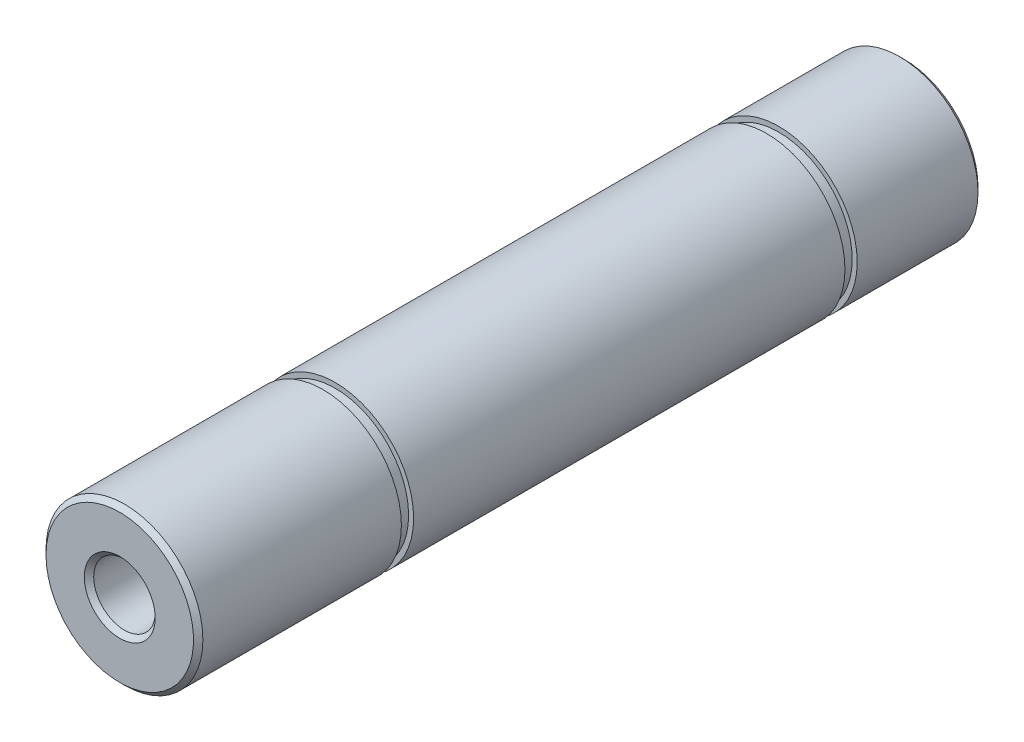
ISO-10303-21;
HEADER;
FILE_DESCRIPTION(('STEP AP214'),'2;1');
FILE_NAME('part.step','',(''),(''),'','','');
FILE_SCHEMA(('AUTOMOTIVE_DESIGN { 1 0 10303 214 1 1 1 1 }'));
ENDSEC;
DATA;
#1=APPLICATION_CONTEXT('core data for automotive mechanical design processes');
#2=APPLICATION_PROTOCOL_DEFINITION('international standard','automotive_design',2000,#1);
#3=PRODUCT_CONTEXT('',#1,'mechanical');
#4=PRODUCT('Part','Part','',(#3));
#5=PRODUCT_RELATED_PRODUCT_CATEGORY('part','',(#4));
#6=PRODUCT_DEFINITION_FORMATION('','',#4);
#7=PRODUCT_DEFINITION_CONTEXT('part definition',#1,'design');
#8=PRODUCT_DEFINITION('design','',#6,#7);
#9=PRODUCT_DEFINITION_SHAPE('','',#8);
#10=(LENGTH_UNIT() NAMED_UNIT(*) SI_UNIT(.MILLI.,.METRE.));
#11=(NAMED_UNIT(*) PLANE_ANGLE_UNIT() SI_UNIT($,.RADIAN.));
#12=(NAMED_UNIT(*) SI_UNIT($,.STERADIAN.) SOLID_ANGLE_UNIT());
#13=UNCERTAINTY_MEASURE_WITH_UNIT(LENGTH_MEASURE(1.E-05),#10,'distance_accuracy_value','');
#14=(GEOMETRIC_REPRESENTATION_CONTEXT(3) GLOBAL_UNCERTAINTY_ASSIGNED_CONTEXT((#13)) GLOBAL_UNIT_ASSIGNED_CONTEXT((#10,
#11,#12)) REPRESENTATION_CONTEXT('',''));
#15=CARTESIAN_POINT('',(0.,0.,0.));
#16=DIRECTION('',(0.,0.,1.));
#17=DIRECTION('',(1.,0.,0.));
#18=AXIS2_PLACEMENT_3D('',#15,#16,#17);
#19=CARTESIAN_POINT('',(0.,0.,19.0499999999929));
#20=DIRECTION('',(0.,0.,-1.));
#21=DIRECTION('',(-1.,0.,0.));
#22=AXIS2_PLACEMENT_3D('',#19,#20,#21);
#23=CONICAL_SURFACE('',#22,2.48920000001362,1.0297442586847);
#24=CARTESIAN_POINT('',(0.,0.,20.5456622528573));
#25=VERTEX_POINT('',#24);
#26=VERTEX_LOOP('',#25);
#27=FACE_BOUND('',#26,.T.);
#28=CARTESIAN_POINT('',(0.,0.,19.05));
#29=DIRECTION('',(0.,0.,-1.));
#30=DIRECTION('',(-1.,0.,0.));
#31=AXIS2_PLACEMENT_3D('',#28,#29,#30);
#32=CIRCLE('',#31,2.4892);
#33=CARTESIAN_POINT('',(-2.4892,0.,19.05));
#34=VERTEX_POINT('',#33);
#35=EDGE_CURVE('E37',#34,#34,#32,.T.);
#36=ORIENTED_EDGE('',*,*,#35,.T.);
#37=EDGE_LOOP('',(#36));
#38=FACE_BOUND('',#37,.T.);
#39=ADVANCED_FACE('F17',(#27,#38),#23,.F.);
#40=CARTESIAN_POINT('',(0.,0.,44.4499999999266));
#41=DIRECTION('',(0.,0.,1.));
#42=DIRECTION('',(1.,0.,0.));
#43=AXIS2_PLACEMENT_3D('',#40,#41,#42);
#44=CONICAL_SURFACE('',#43,2.48919999989994,1.02974425858057);
#45=CARTESIAN_POINT('',(-1.13686837721616E-10,0.,42.9543377470623));
#46=VERTEX_POINT('',#45);
#47=VERTEX_LOOP('',#46);
#48=FACE_BOUND('',#47,.T.);
#49=CARTESIAN_POINT('',(0.,0.,44.45));
#50=DIRECTION('',(0.,0.,1.));
#51=DIRECTION('',(1.,0.,0.));
#52=AXIS2_PLACEMENT_3D('',#49,#50,#51);
#53=CIRCLE('',#52,2.4892);
#54=CARTESIAN_POINT('',(2.4892,0.,44.45));
#55=VERTEX_POINT('',#54);
#56=EDGE_CURVE('E39',#55,#55,#53,.T.);
#57=ORIENTED_EDGE('',*,*,#56,.T.);
#58=EDGE_LOOP('',(#57));
#59=FACE_BOUND('',#58,.T.);
#60=ADVANCED_FACE('F34',(#48,#59),#44,.F.);
#61=CARTESIAN_POINT('',(0.,0.,9.525));
#62=DIRECTION('',(0.,0.,-1.));
#63=DIRECTION('',(-1.,0.,0.));
#64=AXIS2_PLACEMENT_3D('',#61,#62,#63);
#65=CYLINDRICAL_SURFACE('',#64,2.4892);
#66=CARTESIAN_POINT('',(0.,0.,0.381000000004406));
#67=DIRECTION('',(0.,0.,-1.));
#68=DIRECTION('',(1.,0.,0.));
#69=AXIS2_PLACEMENT_3D('',#66,#67,#68);
#70=CIRCLE('',#69,2.48920000001362);
#71=CARTESIAN_POINT('',(2.48920000001362,0.,0.381000000004406));
#72=VERTEX_POINT('',#71);
#73=EDGE_CURVE('E42',#72,#72,#70,.T.);
#74=ORIENTED_EDGE('',*,*,#73,.T.);
#75=EDGE_LOOP('',(#74));
#76=FACE_BOUND('',#75,.T.);
#77=ORIENTED_EDGE('',*,*,#35,.F.);
#78=EDGE_LOOP('',(#77));
#79=FACE_BOUND('',#78,.T.);
#80=ADVANCED_FACE('F272',(#76,#79),#65,.F.);
#81=CARTESIAN_POINT('',(0.,0.,53.975));
#82=DIRECTION('',(0.,0.,1.));
#83=DIRECTION('',(1.,0.,0.));
#84=AXIS2_PLACEMENT_3D('',#81,#82,#83);
#85=CYLINDRICAL_SURFACE('',#84,2.4892);
#86=CARTESIAN_POINT('',(0.,0.,63.1190000000856));
#87=DIRECTION('',(0.,0.,1.));
#88=DIRECTION('',(-1.,0.,0.));
#89=AXIS2_PLACEMENT_3D('',#86,#87,#88);
#90=CIRCLE('',#89,2.48920000001362);
#91=CARTESIAN_POINT('',(-2.48920000001362,0.,63.1190000000856));
#92=VERTEX_POINT('',#91);
#93=EDGE_CURVE('E81',#92,#92,#90,.T.);
#94=ORIENTED_EDGE('',*,*,#93,.T.);
#95=EDGE_LOOP('',(#94));
#96=FACE_BOUND('',#95,.T.);
#97=ORIENTED_EDGE('',*,*,#56,.F.);
#98=EDGE_LOOP('',(#97));
#99=FACE_BOUND('',#98,.T.);
#100=ADVANCED_FACE('F263',(#96,#99),#85,.F.);
#101=CARTESIAN_POINT('',(0.,0.,1.13686837721616E-10));
#102=DIRECTION('',(0.,0.,-1.));
#103=DIRECTION('',(-1.,0.,0.));
#104=AXIS2_PLACEMENT_3D('',#101,#102,#103);
#105=CONICAL_SURFACE('',#104,2.87019999990434,0.785398163397448);
#106=CARTESIAN_POINT('',(0.,0.,5.6843418860808E-11));
#107=DIRECTION('',(0.,0.,-1.));
#108=DIRECTION('',(-1.,0.,0.));
#109=AXIS2_PLACEMENT_3D('',#106,#107,#108);
#110=CIRCLE('',#109,2.87019999996119);
#111=CARTESIAN_POINT('',(-2.87019999996119,0.,5.6843418860808E-11));
#112=VERTEX_POINT('',#111);
#113=EDGE_CURVE('E20',#112,#112,#110,.F.);
#114=ORIENTED_EDGE('',*,*,#113,.F.);
#115=EDGE_LOOP('',(#114));
#116=FACE_BOUND('',#115,.T.);
#117=ORIENTED_EDGE('',*,*,#73,.F.);
#118=EDGE_LOOP('',(#117));
#119=FACE_BOUND('',#118,.T.);
#120=ADVANCED_FACE('F255',(#116,#119),#105,.F.);
#121=CARTESIAN_POINT('',(0.,0.,63.4999999999764));
#122=DIRECTION('',(0.,0.,1.));
#123=DIRECTION('',(1.,0.,0.));
#124=AXIS2_PLACEMENT_3D('',#121,#122,#123);
#125=CONICAL_SURFACE('',#124,2.87019999990434,0.785398163472046);
#126=CARTESIAN_POINT('',(0.,0.,63.5000000000332));
#127=DIRECTION('',(0.,0.,1.));
#128=DIRECTION('',(1.,0.,0.));
#129=AXIS2_PLACEMENT_3D('',#126,#127,#128);
#130=CIRCLE('',#129,2.87019999996119);
#131=CARTESIAN_POINT('',(2.87019999996119,0.,63.5000000000332));
#132=VERTEX_POINT('',#131);
#133=EDGE_CURVE('E76',#132,#132,#130,.T.);
#134=ORIENTED_EDGE('',*,*,#133,.T.);
#135=EDGE_LOOP('',(#134));
#136=FACE_BOUND('',#135,.T.);
#137=ORIENTED_EDGE('',*,*,#93,.F.);
#138=EDGE_LOOP('',(#137));
#139=FACE_BOUND('',#138,.T.);
#140=ADVANCED_FACE('F126',(#136,#139),#125,.F.);
#141=CARTESIAN_POINT('',(0.,0.,0.));
#142=DIRECTION('',(0.,0.,-1.));
#143=DIRECTION('',(-1.,0.,0.));
#144=AXIS2_PLACEMENT_3D('',#141,#142,#143);
#145=PLANE('',#144);
#146=ORIENTED_EDGE('',*,*,#113,.T.);
#147=EDGE_LOOP('',(#146));
#148=FACE_BOUND('',#147,.T.);
#149=CARTESIAN_POINT('',(0.,0.,0.));
#150=DIRECTION('',(0.,0.,1.));
#151=DIRECTION('',(1.,0.,0.));
#152=AXIS2_PLACEMENT_3D('',#149,#150,#151);
#153=CIRCLE('',#152,5.96900000005007);
#154=CARTESIAN_POINT('',(5.96900000005007,0.,0.));
#155=VERTEX_POINT('',#154);
#156=EDGE_CURVE('E74',#155,#155,#153,.T.);
#157=ORIENTED_EDGE('',*,*,#156,.F.);
#158=EDGE_LOOP('',(#157));
#159=FACE_BOUND('',#158,.T.);
#160=ADVANCED_FACE('F116',(#148,#159),#145,.T.);
#161=CARTESIAN_POINT('',(0.,0.,63.5));
#162=DIRECTION('',(0.,0.,-1.));
#163=DIRECTION('',(-1.,0.,0.));
#164=AXIS2_PLACEMENT_3D('',#161,#162,#163);
#165=PLANE('',#164);
#166=ORIENTED_EDGE('',*,*,#133,.F.);
#167=EDGE_LOOP('',(#166));
#168=FACE_BOUND('',#167,.T.);
#169=CARTESIAN_POINT('',(0.,0.,63.5000000000332));
#170=DIRECTION('',(0.,0.,-1.));
#171=DIRECTION('',(-1.,0.,0.));
#172=AXIS2_PLACEMENT_3D('',#169,#170,#171);
#173=CIRCLE('',#172,5.96899999993639);
#174=CARTESIAN_POINT('',(-5.96899999993639,0.,63.5000000000332));
#175=VERTEX_POINT('',#174);
#176=EDGE_CURVE('E70',#175,#175,#173,.T.);
#177=ORIENTED_EDGE('',*,*,#176,.F.);
#178=EDGE_LOOP('',(#177));
#179=FACE_BOUND('',#178,.T.);
#180=ADVANCED_FACE('F114',(#168,#179),#165,.F.);
#181=CARTESIAN_POINT('',(0.,0.,0.380999999890719));
#182=DIRECTION('',(0.,0.,1.));
#183=DIRECTION('',(1.,0.,0.));
#184=AXIS2_PLACEMENT_3D('',#181,#182,#183);
#185=CONICAL_SURFACE('',#184,6.34999999994079,0.785398163397448);
#186=ORIENTED_EDGE('',*,*,#156,.T.);
#187=EDGE_LOOP('',(#186));
#188=FACE_BOUND('',#187,.T.);
#189=CARTESIAN_POINT('',(0.,0.,0.381));
#190=DIRECTION('',(0.,0.,1.));
#191=DIRECTION('',(1.,0.,0.));
#192=AXIS2_PLACEMENT_3D('',#189,#190,#191);
#193=CIRCLE('',#192,6.35);
#194=CARTESIAN_POINT('',(6.35,0.,0.381));
#195=VERTEX_POINT('',#194);
#196=EDGE_CURVE('E73',#195,#195,#193,.T.);
#197=ORIENTED_EDGE('',*,*,#196,.F.);
#198=EDGE_LOOP('',(#197));
#199=FACE_BOUND('',#198,.T.);
#200=ADVANCED_FACE('F110',(#188,#199),#185,.T.);
#201=CARTESIAN_POINT('',(0.,0.,63.1190000000288));
#202=DIRECTION('',(0.,0.,-1.));
#203=DIRECTION('',(-1.,0.,0.));
#204=AXIS2_PLACEMENT_3D('',#201,#202,#203);
#205=CONICAL_SURFACE('',#204,6.34999999994079,0.785398163397448);
#206=CARTESIAN_POINT('',(0.,0.,63.119));
#207=DIRECTION('',(0.,0.,1.));
#208=DIRECTION('',(1.,0.,0.));
#209=AXIS2_PLACEMENT_3D('',#206,#207,#208);
#210=CIRCLE('',#209,6.35);
#211=CARTESIAN_POINT('',(6.35,0.,63.119));
#212=VERTEX_POINT('',#211);
#213=EDGE_CURVE('E69',#212,#212,#210,.F.);
#214=ORIENTED_EDGE('',*,*,#213,.F.);
#215=EDGE_LOOP('',(#214));
#216=FACE_BOUND('',#215,.T.);
#217=ORIENTED_EDGE('',*,*,#176,.T.);
#218=EDGE_LOOP('',(#217));
#219=FACE_BOUND('',#218,.T.);
#220=ADVANCED_FACE('F106',(#216,#219),#205,.T.);
#221=CARTESIAN_POINT('',(0.,0.,0.));
#222=DIRECTION('',(0.,0.,1.));
#223=DIRECTION('',(1.,0.,0.));
#224=AXIS2_PLACEMENT_3D('',#221,#222,#223);
#225=CYLINDRICAL_SURFACE('',#224,6.35);
#226=ORIENTED_EDGE('',*,*,#196,.T.);
#227=EDGE_LOOP('',(#226));
#228=FACE_BOUND('',#227,.T.);
#229=CARTESIAN_POINT('',(0.,0.,10.1575669534634));
#230=DIRECTION('',(0.,0.,1.));
#231=DIRECTION('',(1.,0.,0.));
#232=AXIS2_PLACEMENT_3D('',#229,#230,#231);
#233=CIRCLE('',#232,6.35);
#234=CARTESIAN_POINT('',(6.35,0.,10.1575669534634));
#235=VERTEX_POINT('',#234);
#236=EDGE_CURVE('E66',#235,#235,#233,.F.);
#237=ORIENTED_EDGE('',*,*,#236,.T.);
#238=EDGE_LOOP('',(#237));
#239=FACE_BOUND('',#238,.T.);
#240=ADVANCED_FACE('F109',(#228,#239),#225,.T.);
#241=CARTESIAN_POINT('',(0.,0.,0.));
#242=DIRECTION('',(0.,0.,1.));
#243=DIRECTION('',(1.,0.,0.));
#244=AXIS2_PLACEMENT_3D('',#241,#242,#243);
#245=CYLINDRICAL_SURFACE('',#244,6.35);
#246=CARTESIAN_POINT('',(0.,0.,47.0525985546987));
#247=DIRECTION('',(0.,0.,1.));
#248=DIRECTION('',(1.,0.,0.));
#249=AXIS2_PLACEMENT_3D('',#246,#247,#248);
#250=CIRCLE('',#249,6.35);
#251=CARTESIAN_POINT('',(6.35,0.,47.0525985546987));
#252=VERTEX_POINT('',#251);
#253=EDGE_CURVE('E63',#252,#252,#250,.T.);
#254=ORIENTED_EDGE('',*,*,#253,.T.);
#255=EDGE_LOOP('',(#254));
#256=FACE_BOUND('',#255,.T.);
#257=ORIENTED_EDGE('',*,*,#213,.T.);
#258=EDGE_LOOP('',(#257));
#259=FACE_BOUND('',#258,.T.);
#260=ADVANCED_FACE('F104',(#256,#259),#245,.T.);
#261=CARTESIAN_POINT('',(-6.1468,0.,10.1575669534634));
#262=DIRECTION('',(0.,0.,-1.));
#263=DIRECTION('',(-1.,0.,0.));
#264=AXIS2_PLACEMENT_3D('',#261,#262,#263);
#265=PLANE('',#264);
#266=CARTESIAN_POINT('',(0.,0.,10.1575669534634));
#267=DIRECTION('',(0.,0.,1.));
#268=DIRECTION('',(1.,0.,0.));
#269=AXIS2_PLACEMENT_3D('',#266,#267,#268);
#270=CIRCLE('',#269,5.9436);
#271=CARTESIAN_POINT('',(5.9436,0.,10.1575669534634));
#272=VERTEX_POINT('',#271);
#273=EDGE_CURVE('E60',#272,#272,#270,.T.);
#274=ORIENTED_EDGE('',*,*,#273,.F.);
#275=EDGE_LOOP('',(#274));
#276=FACE_BOUND('',#275,.T.);
#277=ORIENTED_EDGE('',*,*,#236,.F.);
#278=EDGE_LOOP('',(#277));
#279=FACE_BOUND('',#278,.T.);
#280=ADVANCED_FACE('F155',(#276,#279),#265,.F.);
#281=CARTESIAN_POINT('',(-6.1468,0.,47.0525985546987));
#282=DIRECTION('',(0.,0.,1.));
#283=DIRECTION('',(1.,0.,0.));
#284=AXIS2_PLACEMENT_3D('',#281,#282,#283);
#285=PLANE('',#284);
#286=ORIENTED_EDGE('',*,*,#253,.F.);
#287=EDGE_LOOP('',(#286));
#288=FACE_BOUND('',#287,.T.);
#289=CARTESIAN_POINT('',(0.,0.,47.0525985546987));
#290=DIRECTION('',(0.,0.,1.));
#291=DIRECTION('',(1.,0.,0.));
#292=AXIS2_PLACEMENT_3D('',#289,#290,#291);
#293=CIRCLE('',#292,5.9436);
#294=CARTESIAN_POINT('',(5.9436,0.,47.0525985546987));
#295=VERTEX_POINT('',#294);
#296=EDGE_CURVE('E57',#295,#295,#293,.F.);
#297=ORIENTED_EDGE('',*,*,#296,.F.);
#298=EDGE_LOOP('',(#297));
#299=FACE_BOUND('',#298,.T.);
#300=ADVANCED_FACE('F151',(#288,#299),#285,.F.);
#301=CARTESIAN_POINT('',(0.,0.,10.6528669534634));
#302=DIRECTION('',(0.,0.,1.));
#303=DIRECTION('',(1.,0.,0.));
#304=AXIS2_PLACEMENT_3D('',#301,#302,#303);
#305=CYLINDRICAL_SURFACE('',#304,5.9436);
#306=CARTESIAN_POINT('',(0.,0.,11.1481669534634));
#307=DIRECTION('',(0.,0.,1.));
#308=DIRECTION('',(1.,0.,0.));
#309=AXIS2_PLACEMENT_3D('',#306,#307,#308);
#310=CIRCLE('',#309,5.9436);
#311=CARTESIAN_POINT('',(5.9436,0.,11.1481669534634));
#312=VERTEX_POINT('',#311);
#313=EDGE_CURVE('E54',#312,#312,#310,.F.);
#314=ORIENTED_EDGE('',*,*,#313,.T.);
#315=EDGE_LOOP('',(#314));
#316=FACE_BOUND('',#315,.T.);
#317=ORIENTED_EDGE('',*,*,#273,.T.);
#318=EDGE_LOOP('',(#317));
#319=FACE_BOUND('',#318,.T.);
#320=ADVANCED_FACE('F147',(#316,#319),#305,.T.);
#321=CARTESIAN_POINT('',(0.,0.,46.5572985546988));
#322=DIRECTION('',(0.,0.,1.));
#323=DIRECTION('',(1.,0.,0.));
#324=AXIS2_PLACEMENT_3D('',#321,#322,#323);
#325=CYLINDRICAL_SURFACE('',#324,5.9436);
#326=ORIENTED_EDGE('',*,*,#296,.T.);
#327=EDGE_LOOP('',(#326));
#328=FACE_BOUND('',#327,.T.);
#329=CARTESIAN_POINT('',(0.,0.,46.0619985546988));
#330=DIRECTION('',(0.,0.,1.));
#331=DIRECTION('',(1.,0.,0.));
#332=AXIS2_PLACEMENT_3D('',#329,#330,#331);
#333=CIRCLE('',#332,5.9436);
#334=CARTESIAN_POINT('',(5.9436,0.,46.0619985546988));
#335=VERTEX_POINT('',#334);
#336=EDGE_CURVE('E51',#335,#335,#333,.T.);
#337=ORIENTED_EDGE('',*,*,#336,.T.);
#338=EDGE_LOOP('',(#337));
#339=FACE_BOUND('',#338,.T.);
#340=ADVANCED_FACE('F143',(#328,#339),#325,.T.);
#341=CARTESIAN_POINT('',(-6.1468,0.,11.1481669534634));
#342=DIRECTION('',(0.,0.,1.));
#343=DIRECTION('',(1.,0.,0.));
#344=AXIS2_PLACEMENT_3D('',#341,#342,#343);
#345=PLANE('',#344);
#346=CARTESIAN_POINT('',(0.,0.,11.1481669534634));
#347=DIRECTION('',(0.,0.,1.));
#348=DIRECTION('',(1.,0.,0.));
#349=AXIS2_PLACEMENT_3D('',#346,#347,#348);
#350=CIRCLE('',#349,6.35);
#351=CARTESIAN_POINT('',(6.35,0.,11.1481669534634));
#352=VERTEX_POINT('',#351);
#353=EDGE_CURVE('E26',#352,#352,#350,.T.);
#354=ORIENTED_EDGE('',*,*,#353,.F.);
#355=EDGE_LOOP('',(#354));
#356=FACE_BOUND('',#355,.T.);
#357=ORIENTED_EDGE('',*,*,#313,.F.);
#358=EDGE_LOOP('',(#357));
#359=FACE_BOUND('',#358,.T.);
#360=ADVANCED_FACE('F136',(#356,#359),#345,.F.);
#361=CARTESIAN_POINT('',(-6.1468,0.,46.0619985546988));
#362=DIRECTION('',(0.,0.,-1.));
#363=DIRECTION('',(-1.,0.,0.));
#364=AXIS2_PLACEMENT_3D('',#361,#362,#363);
#365=PLANE('',#364);
#366=ORIENTED_EDGE('',*,*,#336,.F.);
#367=EDGE_LOOP('',(#366));
#368=FACE_BOUND('',#367,.T.);
#369=CARTESIAN_POINT('',(0.,0.,46.0619985546988));
#370=DIRECTION('',(0.,0.,1.));
#371=DIRECTION('',(1.,0.,0.));
#372=AXIS2_PLACEMENT_3D('',#369,#370,#371);
#373=CIRCLE('',#372,6.35);
#374=CARTESIAN_POINT('',(6.35,0.,46.0619985546988));
#375=VERTEX_POINT('',#374);
#376=EDGE_CURVE('E11',#375,#375,#373,.F.);
#377=ORIENTED_EDGE('',*,*,#376,.F.);
#378=EDGE_LOOP('',(#377));
#379=FACE_BOUND('',#378,.T.);
#380=ADVANCED_FACE('F130',(#368,#379),#365,.F.);
#381=CARTESIAN_POINT('',(0.,0.,0.));
#382=DIRECTION('',(0.,0.,1.));
#383=DIRECTION('',(1.,0.,0.));
#384=AXIS2_PLACEMENT_3D('',#381,#382,#383);
#385=CYLINDRICAL_SURFACE('',#384,6.35);
#386=ORIENTED_EDGE('',*,*,#376,.T.);
#387=EDGE_LOOP('',(#386));
#388=FACE_BOUND('',#387,.T.);
#389=ORIENTED_EDGE('',*,*,#353,.T.);
#390=EDGE_LOOP('',(#389));
#391=FACE_BOUND('',#390,.T.);
#392=ADVANCED_FACE('F128',(#388,#391),#385,.T.);
#393=CLOSED_SHELL('',(#39,#60,#80,#100,#120,#140,#160,#180,#200,#220,#240,#260,#280,#300,#320,
#340,#360,#380,#392));
#394=MANIFOLD_SOLID_BREP('B1',#393);
#395=ADVANCED_BREP_SHAPE_REPRESENTATION('',(#18,#394),#14);
#396=SHAPE_DEFINITION_REPRESENTATION(#9,#395);
ENDSEC;
END-ISO-10303-21;
